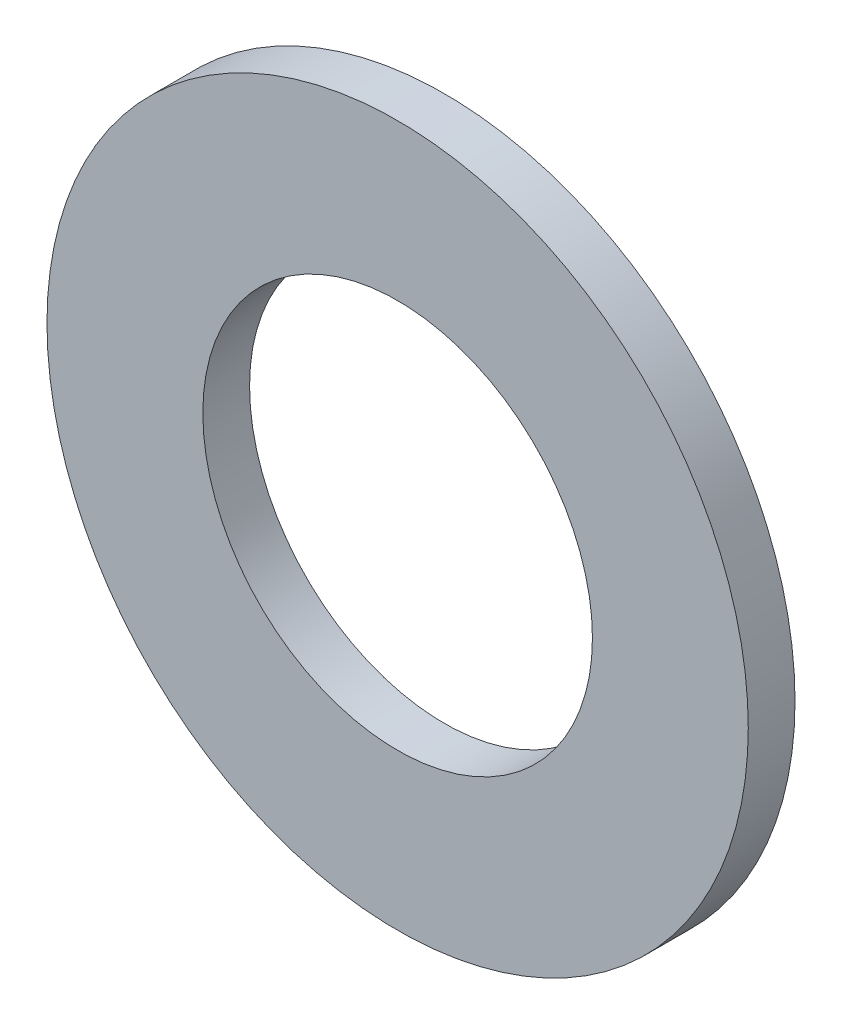
ISO-10303-21;
HEADER;
FILE_DESCRIPTION(('STEP AP214'),'2;1');
FILE_NAME('part.step','',(''),(''),'','','');
FILE_SCHEMA(('AUTOMOTIVE_DESIGN { 1 0 10303 214 1 1 1 1 }'));
ENDSEC;
DATA;
#1=APPLICATION_CONTEXT('core data for automotive mechanical design processes');
#2=APPLICATION_PROTOCOL_DEFINITION('international standard','automotive_design',2000,#1);
#3=PRODUCT_CONTEXT('',#1,'mechanical');
#4=PRODUCT('Part','Part','',(#3));
#5=PRODUCT_RELATED_PRODUCT_CATEGORY('part','',(#4));
#6=PRODUCT_DEFINITION_FORMATION('','',#4);
#7=PRODUCT_DEFINITION_CONTEXT('part definition',#1,'design');
#8=PRODUCT_DEFINITION('design','',#6,#7);
#9=PRODUCT_DEFINITION_SHAPE('','',#8);
#10=(LENGTH_UNIT() NAMED_UNIT(*) SI_UNIT(.MILLI.,.METRE.));
#11=(NAMED_UNIT(*) PLANE_ANGLE_UNIT() SI_UNIT($,.RADIAN.));
#12=(NAMED_UNIT(*) SI_UNIT($,.STERADIAN.) SOLID_ANGLE_UNIT());
#13=UNCERTAINTY_MEASURE_WITH_UNIT(LENGTH_MEASURE(1.E-05),#10,'distance_accuracy_value','');
#14=(GEOMETRIC_REPRESENTATION_CONTEXT(3) GLOBAL_UNCERTAINTY_ASSIGNED_CONTEXT((#13)) GLOBAL_UNIT_ASSIGNED_CONTEXT((#10,
#11,#12)) REPRESENTATION_CONTEXT('',''));
#15=CARTESIAN_POINT('',(0.,0.,0.));
#16=DIRECTION('',(0.,0.,1.));
#17=DIRECTION('',(1.,0.,0.));
#18=AXIS2_PLACEMENT_3D('',#15,#16,#17);
#19=CARTESIAN_POINT('',(0.,0.,3.));
#20=DIRECTION('',(0.,0.,-1.));
#21=DIRECTION('',(-1.,0.,0.));
#22=AXIS2_PLACEMENT_3D('',#19,#20,#21);
#23=CYLINDRICAL_SURFACE('',#22,22.5);
#24=CARTESIAN_POINT('',(0.,0.,3.));
#25=DIRECTION('',(0.,0.,1.));
#26=DIRECTION('',(1.,0.,0.));
#27=AXIS2_PLACEMENT_3D('',#24,#25,#26);
#28=CIRCLE('',#27,22.5);
#29=CARTESIAN_POINT('',(22.5,0.,3.));
#30=VERTEX_POINT('',#29);
#31=EDGE_CURVE('E10',#30,#30,#28,.T.);
#32=ORIENTED_EDGE('',*,*,#31,.F.);
#33=EDGE_LOOP('',(#32));
#34=FACE_BOUND('',#33,.T.);
#35=CARTESIAN_POINT('',(0.,0.,0.));
#36=DIRECTION('',(0.,0.,1.));
#37=DIRECTION('',(1.,0.,0.));
#38=AXIS2_PLACEMENT_3D('',#35,#36,#37);
#39=CIRCLE('',#38,22.5);
#40=CARTESIAN_POINT('',(22.5,0.,0.));
#41=VERTEX_POINT('',#40);
#42=EDGE_CURVE('E34',#41,#41,#39,.T.);
#43=ORIENTED_EDGE('',*,*,#42,.T.);
#44=EDGE_LOOP('',(#43));
#45=FACE_BOUND('',#44,.T.);
#46=ADVANCED_FACE('F31',(#34,#45),#23,.T.);
#47=CARTESIAN_POINT('',(0.,0.,3.));
#48=DIRECTION('',(0.,0.,1.));
#49=DIRECTION('',(1.,0.,0.));
#50=AXIS2_PLACEMENT_3D('',#47,#48,#49);
#51=PLANE('',#50);
#52=CARTESIAN_POINT('',(0.,0.,3.));
#53=DIRECTION('',(0.,0.,1.));
#54=DIRECTION('',(1.,0.,0.));
#55=AXIS2_PLACEMENT_3D('',#52,#53,#54);
#56=CIRCLE('',#55,12.5);
#57=CARTESIAN_POINT('',(12.5,0.,3.));
#58=VERTEX_POINT('',#57);
#59=EDGE_CURVE('E43',#58,#58,#56,.T.);
#60=ORIENTED_EDGE('',*,*,#59,.F.);
#61=EDGE_LOOP('',(#60));
#62=FACE_BOUND('',#61,.T.);
#63=ORIENTED_EDGE('',*,*,#31,.T.);
#64=EDGE_LOOP('',(#63));
#65=FACE_BOUND('',#64,.T.);
#66=ADVANCED_FACE('F58',(#62,#65),#51,.T.);
#67=CARTESIAN_POINT('',(0.,0.,0.));
#68=DIRECTION('',(0.,0.,1.));
#69=DIRECTION('',(1.,0.,0.));
#70=AXIS2_PLACEMENT_3D('',#67,#68,#69);
#71=PLANE('',#70);
#72=CARTESIAN_POINT('',(0.,0.,0.));
#73=DIRECTION('',(0.,0.,1.));
#74=DIRECTION('',(1.,0.,0.));
#75=AXIS2_PLACEMENT_3D('',#72,#73,#74);
#76=CIRCLE('',#75,12.5);
#77=CARTESIAN_POINT('',(12.5,0.,0.));
#78=VERTEX_POINT('',#77);
#79=EDGE_CURVE('E41',#78,#78,#76,.T.);
#80=ORIENTED_EDGE('',*,*,#79,.T.);
#81=EDGE_LOOP('',(#80));
#82=FACE_BOUND('',#81,.T.);
#83=ORIENTED_EDGE('',*,*,#42,.F.);
#84=EDGE_LOOP('',(#83));
#85=FACE_BOUND('',#84,.T.);
#86=ADVANCED_FACE('F49',(#82,#85),#71,.F.);
#87=CARTESIAN_POINT('',(0.,0.,0.));
#88=DIRECTION('',(0.,0.,1.));
#89=DIRECTION('',(1.,0.,0.));
#90=AXIS2_PLACEMENT_3D('',#87,#88,#89);
#91=CYLINDRICAL_SURFACE('',#90,12.5);
#92=ORIENTED_EDGE('',*,*,#79,.F.);
#93=EDGE_LOOP('',(#92));
#94=FACE_BOUND('',#93,.T.);
#95=ORIENTED_EDGE('',*,*,#59,.T.);
#96=EDGE_LOOP('',(#95));
#97=FACE_BOUND('',#96,.T.);
#98=ADVANCED_FACE('F52',(#94,#97),#91,.F.);
#99=CLOSED_SHELL('',(#46,#66,#86,#98));
#100=MANIFOLD_SOLID_BREP('B2',#99);
#101=ADVANCED_BREP_SHAPE_REPRESENTATION('',(#18,#100),#14);
#102=SHAPE_DEFINITION_REPRESENTATION(#9,#101);
ENDSEC;
END-ISO-10303-21;
